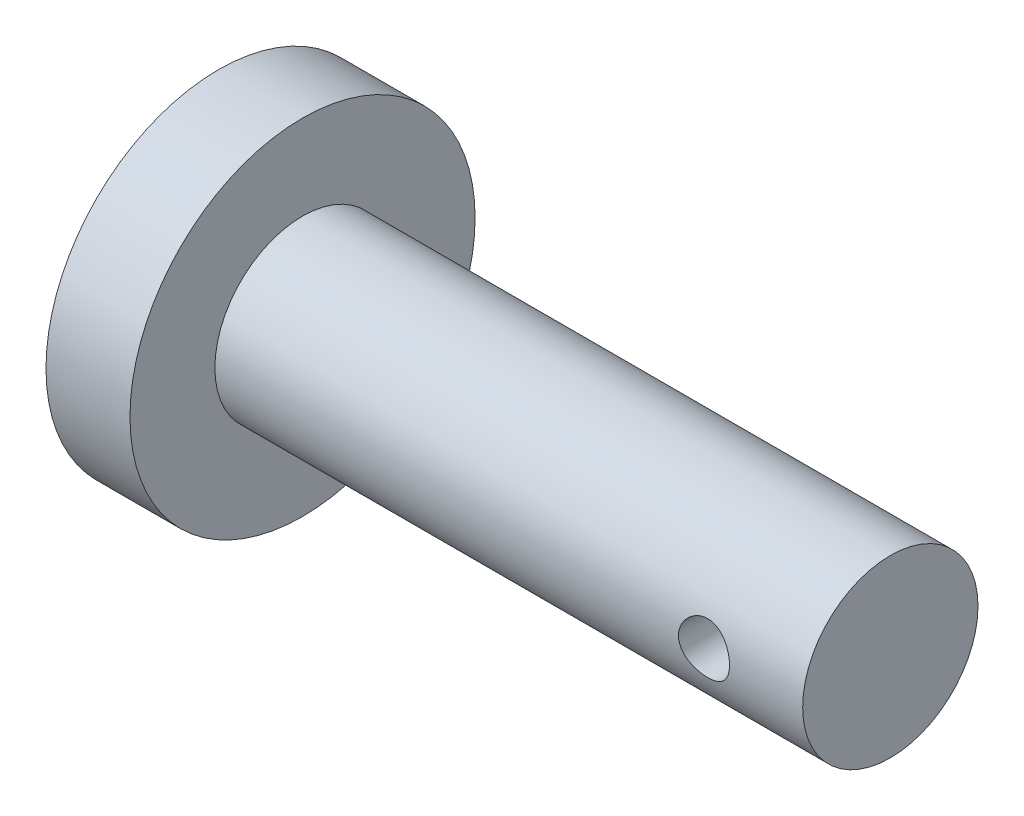
ISO-10303-21;
HEADER;
FILE_DESCRIPTION(('STEP AP214'),'2;1');
FILE_NAME('part.step','',(''),(''),'','','');
FILE_SCHEMA(('AUTOMOTIVE_DESIGN { 1 0 10303 214 1 1 1 1 }'));
ENDSEC;
DATA;
#1=APPLICATION_CONTEXT('core data for automotive mechanical design processes');
#2=APPLICATION_PROTOCOL_DEFINITION('international standard','automotive_design',2000,#1);
#3=PRODUCT_CONTEXT('',#1,'mechanical');
#4=PRODUCT('Part','Part','',(#3));
#5=PRODUCT_RELATED_PRODUCT_CATEGORY('part','',(#4));
#6=PRODUCT_DEFINITION_FORMATION('','',#4);
#7=PRODUCT_DEFINITION_CONTEXT('part definition',#1,'design');
#8=PRODUCT_DEFINITION('design','',#6,#7);
#9=PRODUCT_DEFINITION_SHAPE('','',#8);
#10=(LENGTH_UNIT() NAMED_UNIT(*) SI_UNIT(.MILLI.,.METRE.));
#11=(NAMED_UNIT(*) PLANE_ANGLE_UNIT() SI_UNIT($,.RADIAN.));
#12=(NAMED_UNIT(*) SI_UNIT($,.STERADIAN.) SOLID_ANGLE_UNIT());
#13=UNCERTAINTY_MEASURE_WITH_UNIT(LENGTH_MEASURE(1.E-05),#10,'distance_accuracy_value','');
#14=(GEOMETRIC_REPRESENTATION_CONTEXT(3) GLOBAL_UNCERTAINTY_ASSIGNED_CONTEXT((#13)) GLOBAL_UNIT_ASSIGNED_CONTEXT((#10,
#11,#12)) REPRESENTATION_CONTEXT('',''));
#15=CARTESIAN_POINT('',(0.,0.,0.));
#16=DIRECTION('',(0.,0.,1.));
#17=DIRECTION('',(1.,0.,0.));
#18=AXIS2_PLACEMENT_3D('',#15,#16,#17);
#19=CARTESIAN_POINT('',(-70.7036802438284,35.0240747168104,0.));
#20=DIRECTION('',(1.,0.,0.));
#21=DIRECTION('',(0.,0.,-1.));
#22=AXIS2_PLACEMENT_3D('',#19,#20,#21);
#23=PLANE('',#22);
#24=CARTESIAN_POINT('',(-70.7036802438284,0.,0.));
#25=DIRECTION('',(-1.,0.,0.));
#26=DIRECTION('',(0.,0.,1.));
#27=AXIS2_PLACEMENT_3D('',#24,#25,#26);
#28=CIRCLE('',#27,35.0240747168104);
#29=CARTESIAN_POINT('',(-70.7036802438284,0.,35.0240747168104));
#30=VERTEX_POINT('',#29);
#31=EDGE_CURVE('E86',#30,#30,#28,.T.);
#32=ORIENTED_EDGE('',*,*,#31,.T.);
#33=EDGE_LOOP('',(#32));
#34=FACE_BOUND('',#33,.T.);
#35=ADVANCED_FACE('F31',(#34),#23,.F.);
#36=CARTESIAN_POINT('',(65.6467282793692,0.,0.));
#37=DIRECTION('',(-1.,0.,0.));
#38=DIRECTION('',(0.,0.,1.));
#39=AXIS2_PLACEMENT_3D('',#36,#37,#38);
#40=PLANE('',#39);
#41=CARTESIAN_POINT('',(65.6467282793692,0.,0.));
#42=DIRECTION('',(-1.,0.,0.));
#43=DIRECTION('',(0.,0.,1.));
#44=AXIS2_PLACEMENT_3D('',#41,#42,#43);
#45=CIRCLE('',#44,17.7929791342085);
#46=CARTESIAN_POINT('',(65.6467282793692,0.,17.7929791342085));
#47=VERTEX_POINT('',#46);
#48=EDGE_CURVE('E10',#47,#47,#45,.T.);
#49=ORIENTED_EDGE('',*,*,#48,.F.);
#50=EDGE_LOOP('',(#49));
#51=FACE_BOUND('',#50,.T.);
#52=ADVANCED_FACE('F74',(#51),#40,.F.);
#53=CARTESIAN_POINT('',(-70.7036802438284,0.,0.));
#54=DIRECTION('',(-1.,0.,0.));
#55=DIRECTION('',(0.,0.,1.));
#56=AXIS2_PLACEMENT_3D('',#53,#54,#55);
#57=CYLINDRICAL_SURFACE('',#56,17.7929791342085);
#58=CARTESIAN_POINT('',(50.7945730645806,0.,17.7929791342085));
#59=CARTESIAN_POINT('',(50.7945686285328,-0.284733144789994,17.7929760885799));
#60=CARTESIAN_POINT('',(50.7710337285516,-0.569511491423918,17.7860785776257));
#61=CARTESIAN_POINT('',(50.6777238773997,-1.13079912524086,17.7592357376243));
#62=CARTESIAN_POINT('',(50.6079328686322,-1.40730550599851,17.7392858775448));
#63=CARTESIAN_POINT('',(50.4246212889823,-1.94387086013636,17.6885286588989));
#64=CARTESIAN_POINT('',(50.3111630682086,-2.20395267171892,17.6577367863833));
#65=CARTESIAN_POINT('',(50.0439868684606,-2.7014001343463,17.5885103862594));
#66=CARTESIAN_POINT('',(49.8902642276227,-2.9387631506334,17.5500749737968));
#67=CARTESIAN_POINT('',(49.5425094910743,-3.39049863049291,17.468504450708));
#68=CARTESIAN_POINT('',(49.3475815926004,-3.60416482740099,17.4252772259664));
#69=CARTESIAN_POINT('',(48.9248603162399,-3.99628412134235,17.3395556039622));
#70=CARTESIAN_POINT('',(48.6970617923329,-4.17473169439085,17.2970613226131));
#71=CARTESIAN_POINT('',(48.2091818540472,-4.4949899774593,17.2166514215092));
#72=CARTESIAN_POINT('',(47.9485227120784,-4.63595213989541,17.1788507625633));
#73=CARTESIAN_POINT('',(47.4059212689614,-4.87175834357353,17.1134788053403));
#74=CARTESIAN_POINT('',(47.1239837673302,-4.96661274911397,17.085905208511));
#75=CARTESIAN_POINT('',(46.554731571212,-5.10498945564441,17.0450668827467));
#76=CARTESIAN_POINT('',(46.2677585602407,-5.1498081717305,17.0314415760816));
#77=CARTESIAN_POINT('',(45.6900680644537,-5.19088790752157,17.0189685603539));
#78=CARTESIAN_POINT('',(45.3993514440651,-5.18715994305558,17.0201174988356));
#79=CARTESIAN_POINT('',(44.8328505668861,-5.13227335521203,17.0367427211168));
#80=CARTESIAN_POINT('',(44.5568938500744,-5.08272343369511,17.0517330393632));
#81=CARTESIAN_POINT('',(44.0173928348953,-4.94019247322833,17.0935679930486));
#82=CARTESIAN_POINT('',(43.7538497009669,-4.84720736879693,17.1204137381287));
#83=CARTESIAN_POINT('',(43.2426525157527,-4.6192271239707,17.1833330575764));
#84=CARTESIAN_POINT('',(42.9952510724775,-4.48369893911845,17.2195226230452));
#85=CARTESIAN_POINT('',(42.5261559871156,-4.17485046466484,17.2969944099726));
#86=CARTESIAN_POINT('',(42.3044682843065,-4.00152147047539,17.338277803461));
#87=CARTESIAN_POINT('',(41.8839504152498,-3.61393793104456,17.4232707193018));
#88=CARTESIAN_POINT('',(41.6863591962854,-3.39834390212263,17.4670118621964));
#89=CARTESIAN_POINT('',(41.3298569323279,-2.93653687928089,17.5505510365203));
#90=CARTESIAN_POINT('',(41.1709480530229,-2.6903221721825,17.5903488471023));
#91=CARTESIAN_POINT('',(40.8956263286481,-2.17210196262014,17.6618462442122));
#92=CARTESIAN_POINT('',(40.7794745403127,-1.89995039408671,17.693495739182));
#93=CARTESIAN_POINT('',(40.5949494225693,-1.33884239243986,17.7447695577029));
#94=CARTESIAN_POINT('',(40.526563555252,-1.04989039080092,17.7643970367044));
#95=CARTESIAN_POINT('',(40.4415421848711,-0.473927311763089,17.7889221295961));
#96=CARTESIAN_POINT('',(40.4232261821731,-0.18718428698604,17.7942978812837));
#97=CARTESIAN_POINT('',(40.434173040243,0.385290207752346,17.7911089582211));
#98=CARTESIAN_POINT('',(40.4634299451884,0.67102179985054,17.7825460285041));
#99=CARTESIAN_POINT('',(40.5673274094997,1.22711321476723,17.7527538993243));
#100=CARTESIAN_POINT('',(40.6409980932875,1.49767011832324,17.7317955622634));
#101=CARTESIAN_POINT('',(40.8304760333644,2.02253456311167,17.6796232868571));
#102=CARTESIAN_POINT('',(40.9462882419787,2.27684019041974,17.6484081432093));
#103=CARTESIAN_POINT('',(41.2196618009681,2.76826105755004,17.5781076028638));
#104=CARTESIAN_POINT('',(41.3780943025685,3.00486825123937,17.5388626231518));
#105=CARTESIAN_POINT('',(41.7311430461909,3.44871573902896,17.4570182717581));
#106=CARTESIAN_POINT('',(41.9257678463045,3.65594906686911,17.4144181080803));
#107=CARTESIAN_POINT('',(42.3535617884654,4.04248243286205,17.3288492509625));
#108=CARTESIAN_POINT('',(42.5878190066714,4.22058892996483,17.2859175291403));
#109=CARTESIAN_POINT('',(43.0838256114483,4.53503159463018,17.2061037965076));
#110=CARTESIAN_POINT('',(43.3455741231072,4.67136909095268,17.1692215932665));
#111=CARTESIAN_POINT('',(43.8881371137142,4.89742968011578,17.1061123277956));
#112=CARTESIAN_POINT('',(44.1688463292179,4.98738949426187,17.0798313077196));
#113=CARTESIAN_POINT('',(44.7423279281973,5.11852626109649,17.0409965334765));
#114=CARTESIAN_POINT('',(45.0350964431958,5.15971873357244,17.0284384122128));
#115=CARTESIAN_POINT('',(45.6120376438381,5.19113833956582,17.0188843333783));
#116=CARTESIAN_POINT('',(45.89609643259,5.18330324877903,17.0212966491867));
#117=CARTESIAN_POINT('',(46.458657202274,5.12148031671153,17.0399990036733));
#118=CARTESIAN_POINT('',(46.7371593822362,5.06749413154789,17.0562885443718));
#119=CARTESIAN_POINT('',(47.2777320280446,4.91611967163549,17.1005245957726));
#120=CARTESIAN_POINT('',(47.5399498565404,4.81921670584523,17.1283405440104));
#121=CARTESIAN_POINT('',(48.044613893316,4.58513545281242,17.1924780125916));
#122=CARTESIAN_POINT('',(48.2870564786733,4.44794980666565,17.2288010867848));
#123=CARTESIAN_POINT('',(48.7543508102497,4.13163893085648,17.3074278405977));
#124=CARTESIAN_POINT('',(48.9783046214588,3.95122772249445,17.3498948686912));
#125=CARTESIAN_POINT('',(49.3933876707125,3.55593686930158,17.4352011587551));
#126=CARTESIAN_POINT('',(49.5845085310006,3.34104845413164,17.4780405128083));
#127=CARTESIAN_POINT('',(49.9336294109439,2.875905966544,17.5606515135473));
#128=CARTESIAN_POINT('',(50.0905950407897,2.62485323755458,17.6003090031428));
#129=CARTESIAN_POINT('',(50.3598609582364,2.09876571858512,17.6707534997267));
#130=CARTESIAN_POINT('',(50.4721843089781,1.82374340157783,17.7015450847567));
#131=CARTESIAN_POINT('',(50.6376443627696,1.29227207803774,17.7477434753543));
#132=CARTESIAN_POINT('',(50.6963396062185,1.03766524602381,17.7645712972059));
#133=CARTESIAN_POINT('',(50.7748031476072,0.522050980122064,17.7871897166591));
#134=CARTESIAN_POINT('',(50.794577131567,0.261044486804458,17.792981926453));
#135=CARTESIAN_POINT('',(50.7945730645806,0.,17.7929791342085));
#136=B_SPLINE_CURVE_WITH_KNOTS('',3,(#58,#59,#60,#61,#62,#63,#64,#65,#66,#67,#68,#69,#70,#71,
#72,#73,#74,#75,#76,#77,#78,#79,#80,#81,#82,#83,#84,#85,#86,#87,#88,#89,#90,#91,#92,#93,#94,#95,
#96,#97,#98,#99,#100,#101,#102,#103,#104,#105,#106,#107,#108,#109,#110,#111,#112,#113,#114,#115,
#116,#117,#118,#119,#120,#121,#122,#123,#124,#125,#126,#127,#128,#129,#130,#131,#132,#133,#134,
#135),.UNSPECIFIED.,.T.,.F.,(4,2,2,2,2,2,2,2,2,2,2,2,2,2,2,2,2,2,2,2,2,2,2,2,2,2,2,2,2,2,2,2,2,
2,2,2,2,2,4),(0.,0.853240986533927,1.70677832702584,2.55910144101165,3.41152328165886,
4.28484228308555,5.1582981545287,6.05010606104926,6.94171341037316,7.80964067224594,
8.6773709943571,9.5157486178043,10.3542047281303,11.203616440224,12.05322395767,
12.9361841667321,13.8191937982658,14.7075086426546,15.5955902286801,16.4534762618266,
17.3112549014234,18.1509481198393,18.9907400479637,19.8492074127462,20.7078780308793,
21.5958301924768,22.4837541035109,23.3670998418772,24.2501643874213,25.0985530030051,
25.9469111757163,26.7859116552459,27.6250655001755,28.4932308532335,29.3616174020528,
30.2534663783767,31.1448540059682,31.927223062612,32.7094778142131),.UNSPECIFIED.);
#137=CARTESIAN_POINT('',(50.7945730645806,0.,17.7929791342085));
#138=VERTEX_POINT('',#137);
#139=EDGE_CURVE('E34',#138,#138,#136,.T.);
#140=ORIENTED_EDGE('',*,*,#139,.T.);
#141=EDGE_LOOP('',(#140));
#142=FACE_BOUND('',#141,.T.);
#143=CARTESIAN_POINT('',(50.7945730645806,0.,-17.7929791342085));
#144=CARTESIAN_POINT('',(50.7945686285328,0.284733144789994,-17.7929760885799));
#145=CARTESIAN_POINT('',(50.7710337285516,0.569511491423918,-17.7860785776257));
#146=CARTESIAN_POINT('',(50.6777238773997,1.13079912524086,-17.7592357376243));
#147=CARTESIAN_POINT('',(50.6079328686322,1.40730550599851,-17.7392858775448));
#148=CARTESIAN_POINT('',(50.4246212889823,1.94387086013636,-17.6885286588989));
#149=CARTESIAN_POINT('',(50.3111630682086,2.20395267171892,-17.6577367863833));
#150=CARTESIAN_POINT('',(50.0439868684606,2.7014001343463,-17.5885103862594));
#151=CARTESIAN_POINT('',(49.8902642276227,2.9387631506334,-17.5500749737968));
#152=CARTESIAN_POINT('',(49.5425094910743,3.39049863049291,-17.468504450708));
#153=CARTESIAN_POINT('',(49.3475815926004,3.60416482740099,-17.4252772259664));
#154=CARTESIAN_POINT('',(48.9248603162399,3.99628412134235,-17.3395556039622));
#155=CARTESIAN_POINT('',(48.6970617923329,4.17473169439085,-17.2970613226131));
#156=CARTESIAN_POINT('',(48.2091818540472,4.4949899774593,-17.2166514215092));
#157=CARTESIAN_POINT('',(47.9485227120784,4.63595213989541,-17.1788507625633));
#158=CARTESIAN_POINT('',(47.4059212689614,4.87175834357353,-17.1134788053403));
#159=CARTESIAN_POINT('',(47.1239837673302,4.96661274911397,-17.085905208511));
#160=CARTESIAN_POINT('',(46.554731571212,5.10498945564441,-17.0450668827467));
#161=CARTESIAN_POINT('',(46.2677585602407,5.1498081717305,-17.0314415760816));
#162=CARTESIAN_POINT('',(45.6900680644537,5.19088790752157,-17.0189685603539));
#163=CARTESIAN_POINT('',(45.3993514440651,5.18715994305558,-17.0201174988356));
#164=CARTESIAN_POINT('',(44.8328505668861,5.13227335521203,-17.0367427211168));
#165=CARTESIAN_POINT('',(44.5568938500744,5.08272343369511,-17.0517330393632));
#166=CARTESIAN_POINT('',(44.0173928348953,4.94019247322833,-17.0935679930486));
#167=CARTESIAN_POINT('',(43.7538497009669,4.84720736879693,-17.1204137381287));
#168=CARTESIAN_POINT('',(43.2426525157527,4.6192271239707,-17.1833330575764));
#169=CARTESIAN_POINT('',(42.9952510724775,4.48369893911845,-17.2195226230452));
#170=CARTESIAN_POINT('',(42.5261559871156,4.17485046466484,-17.2969944099726));
#171=CARTESIAN_POINT('',(42.3044682843065,4.00152147047539,-17.338277803461));
#172=CARTESIAN_POINT('',(41.8839504152498,3.61393793104456,-17.4232707193018));
#173=CARTESIAN_POINT('',(41.6863591962854,3.39834390212263,-17.4670118621964));
#174=CARTESIAN_POINT('',(41.3298569323279,2.93653687928089,-17.5505510365203));
#175=CARTESIAN_POINT('',(41.1709480530229,2.6903221721825,-17.5903488471023));
#176=CARTESIAN_POINT('',(40.8956263286481,2.17210196262014,-17.6618462442122));
#177=CARTESIAN_POINT('',(40.7794745403127,1.89995039408671,-17.693495739182));
#178=CARTESIAN_POINT('',(40.5949494225693,1.33884239243986,-17.7447695577029));
#179=CARTESIAN_POINT('',(40.526563555252,1.04989039080092,-17.7643970367044));
#180=CARTESIAN_POINT('',(40.4415421848711,0.473927311763089,-17.7889221295961));
#181=CARTESIAN_POINT('',(40.4232261821731,0.18718428698604,-17.7942978812837));
#182=CARTESIAN_POINT('',(40.434173040243,-0.385290207752346,-17.7911089582211));
#183=CARTESIAN_POINT('',(40.4634299451884,-0.67102179985054,-17.7825460285041));
#184=CARTESIAN_POINT('',(40.5673274094997,-1.22711321476723,-17.7527538993243));
#185=CARTESIAN_POINT('',(40.6409980932875,-1.49767011832324,-17.7317955622634));
#186=CARTESIAN_POINT('',(40.8304760333644,-2.02253456311167,-17.6796232868571));
#187=CARTESIAN_POINT('',(40.9462882419787,-2.27684019041974,-17.6484081432093));
#188=CARTESIAN_POINT('',(41.2196618009681,-2.76826105755004,-17.5781076028638));
#189=CARTESIAN_POINT('',(41.3780943025685,-3.00486825123937,-17.5388626231518));
#190=CARTESIAN_POINT('',(41.7311430461909,-3.44871573902896,-17.4570182717581));
#191=CARTESIAN_POINT('',(41.9257678463045,-3.65594906686911,-17.4144181080803));
#192=CARTESIAN_POINT('',(42.3535617884654,-4.04248243286205,-17.3288492509625));
#193=CARTESIAN_POINT('',(42.5878190066714,-4.22058892996483,-17.2859175291403));
#194=CARTESIAN_POINT('',(43.0838256114483,-4.53503159463018,-17.2061037965076));
#195=CARTESIAN_POINT('',(43.3455741231072,-4.67136909095268,-17.1692215932665));
#196=CARTESIAN_POINT('',(43.8881371137142,-4.89742968011578,-17.1061123277956));
#197=CARTESIAN_POINT('',(44.1688463292179,-4.98738949426187,-17.0798313077196));
#198=CARTESIAN_POINT('',(44.7423279281973,-5.11852626109649,-17.0409965334765));
#199=CARTESIAN_POINT('',(45.0350964431958,-5.15971873357244,-17.0284384122128));
#200=CARTESIAN_POINT('',(45.6120376438381,-5.19113833956582,-17.0188843333783));
#201=CARTESIAN_POINT('',(45.89609643259,-5.18330324877903,-17.0212966491867));
#202=CARTESIAN_POINT('',(46.458657202274,-5.12148031671153,-17.0399990036733));
#203=CARTESIAN_POINT('',(46.7371593822362,-5.06749413154789,-17.0562885443718));
#204=CARTESIAN_POINT('',(47.2777320280446,-4.91611967163549,-17.1005245957726));
#205=CARTESIAN_POINT('',(47.5399498565404,-4.81921670584523,-17.1283405440104));
#206=CARTESIAN_POINT('',(48.044613893316,-4.58513545281242,-17.1924780125916));
#207=CARTESIAN_POINT('',(48.2870564786733,-4.44794980666565,-17.2288010867848));
#208=CARTESIAN_POINT('',(48.7543508102497,-4.13163893085648,-17.3074278405977));
#209=CARTESIAN_POINT('',(48.9783046214588,-3.95122772249445,-17.3498948686912));
#210=CARTESIAN_POINT('',(49.3933876707125,-3.55593686930158,-17.4352011587551));
#211=CARTESIAN_POINT('',(49.5845085310006,-3.34104845413164,-17.4780405128083));
#212=CARTESIAN_POINT('',(49.9336294109439,-2.875905966544,-17.5606515135473));
#213=CARTESIAN_POINT('',(50.0905950407897,-2.62485323755458,-17.6003090031428));
#214=CARTESIAN_POINT('',(50.3598609582364,-2.09876571858512,-17.6707534997267));
#215=CARTESIAN_POINT('',(50.4721843089781,-1.82374340157783,-17.7015450847567));
#216=CARTESIAN_POINT('',(50.6376443627696,-1.29227207803774,-17.7477434753543));
#217=CARTESIAN_POINT('',(50.6963396062185,-1.03766524602381,-17.7645712972059));
#218=CARTESIAN_POINT('',(50.7748031476072,-0.522050980122064,-17.7871897166591));
#219=CARTESIAN_POINT('',(50.794577131567,-0.261044486804458,-17.792981926453));
#220=CARTESIAN_POINT('',(50.7945730645806,0.,-17.7929791342085));
#221=B_SPLINE_CURVE_WITH_KNOTS('',3,(#143,#144,#145,#146,#147,#148,#149,#150,#151,#152,#153,
#154,#155,#156,#157,#158,#159,#160,#161,#162,#163,#164,#165,#166,#167,#168,#169,#170,#171,#172,
#173,#174,#175,#176,#177,#178,#179,#180,#181,#182,#183,#184,#185,#186,#187,#188,#189,#190,#191,
#192,#193,#194,#195,#196,#197,#198,#199,#200,#201,#202,#203,#204,#205,#206,#207,#208,#209,#210,
#211,#212,#213,#214,#215,#216,#217,#218,#219,#220),.UNSPECIFIED.,.T.,.F.,(4,2,2,2,2,2,2,2,2,2,2,
2,2,2,2,2,2,2,2,2,2,2,2,2,2,2,2,2,2,2,2,2,2,2,2,2,2,2,4),(0.,0.853240986533927,1.70677832702584,
2.55910144101165,3.41152328165886,4.28484228308555,5.1582981545287,6.05010606104926,
6.94171341037316,7.80964067224594,8.6773709943571,9.5157486178043,10.3542047281303,
11.203616440224,12.05322395767,12.9361841667321,13.8191937982658,14.7075086426546,
15.5955902286801,16.4534762618266,17.3112549014234,18.1509481198393,18.9907400479637,
19.8492074127462,20.7078780308793,21.5958301924768,22.4837541035109,23.3670998418772,
24.2501643874213,25.0985530030051,25.9469111757163,26.7859116552459,27.6250655001755,
28.4932308532335,29.3616174020528,30.2534663783767,31.1448540059682,31.927223062612,
32.7094778142131),.UNSPECIFIED.);
#222=CARTESIAN_POINT('',(50.7945730645806,0.,-17.7929791342085));
#223=VERTEX_POINT('',#222);
#224=EDGE_CURVE('E51',#223,#223,#221,.T.);
#225=ORIENTED_EDGE('',*,*,#224,.T.);
#226=EDGE_LOOP('',(#225));
#227=FACE_BOUND('',#226,.T.);
#228=CARTESIAN_POINT('',(-53.6598791784287,0.,0.));
#229=DIRECTION('',(-1.,0.,0.));
#230=DIRECTION('',(0.,0.,1.));
#231=AXIS2_PLACEMENT_3D('',#228,#229,#230);
#232=CIRCLE('',#231,17.7929791342085);
#233=CARTESIAN_POINT('',(-53.6598791784287,0.,17.7929791342085));
#234=VERTEX_POINT('',#233);
#235=EDGE_CURVE('E43',#234,#234,#232,.T.);
#236=ORIENTED_EDGE('',*,*,#235,.F.);
#237=EDGE_LOOP('',(#236));
#238=FACE_BOUND('',#237,.T.);
#239=ORIENTED_EDGE('',*,*,#48,.T.);
#240=EDGE_LOOP('',(#239));
#241=FACE_BOUND('',#240,.T.);
#242=ADVANCED_FACE('F56',(#142,#227,#238,#241),#57,.T.);
#243=CARTESIAN_POINT('',(-53.6598791784287,35.0240747168104,0.));
#244=DIRECTION('',(-1.,0.,0.));
#245=DIRECTION('',(0.,0.,1.));
#246=AXIS2_PLACEMENT_3D('',#243,#244,#245);
#247=PLANE('',#246);
#248=CARTESIAN_POINT('',(-53.6598791784287,0.,0.));
#249=DIRECTION('',(-1.,0.,0.));
#250=DIRECTION('',(0.,0.,1.));
#251=AXIS2_PLACEMENT_3D('',#248,#249,#250);
#252=CIRCLE('',#251,35.0240747168104);
#253=CARTESIAN_POINT('',(-53.6598791784287,0.,35.0240747168104));
#254=VERTEX_POINT('',#253);
#255=EDGE_CURVE('E48',#254,#254,#252,.T.);
#256=ORIENTED_EDGE('',*,*,#255,.F.);
#257=EDGE_LOOP('',(#256));
#258=FACE_BOUND('',#257,.T.);
#259=ORIENTED_EDGE('',*,*,#235,.T.);
#260=EDGE_LOOP('',(#259));
#261=FACE_BOUND('',#260,.T.);
#262=ADVANCED_FACE('F67',(#258,#261),#247,.F.);
#263=CARTESIAN_POINT('',(-70.7036802438284,0.,0.));
#264=DIRECTION('',(-1.,0.,0.));
#265=DIRECTION('',(0.,0.,1.));
#266=AXIS2_PLACEMENT_3D('',#263,#264,#265);
#267=CYLINDRICAL_SURFACE('',#266,35.0240747168104);
#268=ORIENTED_EDGE('',*,*,#31,.F.);
#269=EDGE_LOOP('',(#268));
#270=FACE_BOUND('',#269,.T.);
#271=ORIENTED_EDGE('',*,*,#255,.T.);
#272=EDGE_LOOP('',(#271));
#273=FACE_BOUND('',#272,.T.);
#274=ADVANCED_FACE('F63',(#270,#273),#267,.T.);
#275=CARTESIAN_POINT('',(45.6111630788066,0.,-35.0240747168104));
#276=DIRECTION('',(0.,0.,1.));
#277=DIRECTION('',(1.,0.,0.));
#278=AXIS2_PLACEMENT_3D('',#275,#276,#277);
#279=CYLINDRICAL_SURFACE('',#278,5.18340998577399);
#280=ORIENTED_EDGE('',*,*,#224,.F.);
#281=EDGE_LOOP('',(#280));
#282=FACE_BOUND('',#281,.T.);
#283=ORIENTED_EDGE('',*,*,#139,.F.);
#284=EDGE_LOOP('',(#283));
#285=FACE_BOUND('',#284,.T.);
#286=ADVANCED_FACE('F59',(#282,#285),#279,.F.);
#287=CLOSED_SHELL('',(#35,#52,#242,#262,#274,#286));
#288=MANIFOLD_SOLID_BREP('B2',#287);
#289=ADVANCED_BREP_SHAPE_REPRESENTATION('',(#18,#288),#14);
#290=SHAPE_DEFINITION_REPRESENTATION(#9,#289);
ENDSEC;
END-ISO-10303-21;
